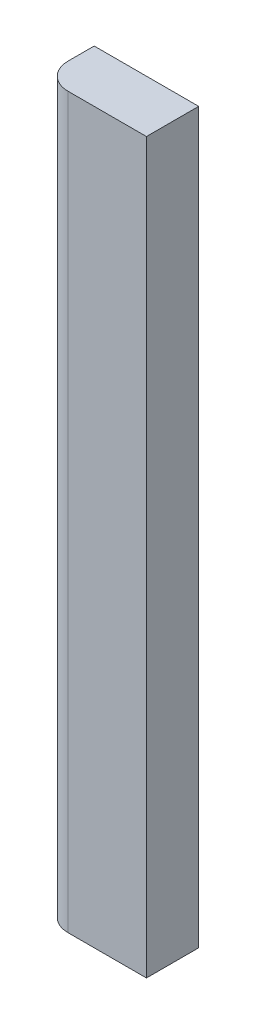
ISO-10303-21;
HEADER;
FILE_DESCRIPTION(('STEP AP214'),'2;1');
FILE_NAME('part.step','',(''),(''),'','','');
FILE_SCHEMA(('AUTOMOTIVE_DESIGN { 1 0 10303 214 1 1 1 1 }'));
ENDSEC;
DATA;
#1=APPLICATION_CONTEXT('core data for automotive mechanical design processes');
#2=APPLICATION_PROTOCOL_DEFINITION('international standard','automotive_design',2000,#1);
#3=PRODUCT_CONTEXT('',#1,'mechanical');
#4=PRODUCT('Part','Part','',(#3));
#5=PRODUCT_RELATED_PRODUCT_CATEGORY('part','',(#4));
#6=PRODUCT_DEFINITION_FORMATION('','',#4);
#7=PRODUCT_DEFINITION_CONTEXT('part definition',#1,'design');
#8=PRODUCT_DEFINITION('design','',#6,#7);
#9=PRODUCT_DEFINITION_SHAPE('','',#8);
#10=(LENGTH_UNIT() NAMED_UNIT(*) SI_UNIT(.MILLI.,.METRE.));
#11=(NAMED_UNIT(*) PLANE_ANGLE_UNIT() SI_UNIT($,.RADIAN.));
#12=(NAMED_UNIT(*) SI_UNIT($,.STERADIAN.) SOLID_ANGLE_UNIT());
#13=UNCERTAINTY_MEASURE_WITH_UNIT(LENGTH_MEASURE(1.E-05),#10,'distance_accuracy_value','');
#14=(GEOMETRIC_REPRESENTATION_CONTEXT(3) GLOBAL_UNCERTAINTY_ASSIGNED_CONTEXT((#13)) GLOBAL_UNIT_ASSIGNED_CONTEXT((#10,
#11,#12)) REPRESENTATION_CONTEXT('',''));
#15=CARTESIAN_POINT('',(0.,0.,0.));
#16=DIRECTION('',(0.,0.,1.));
#17=DIRECTION('',(1.,0.,0.));
#18=AXIS2_PLACEMENT_3D('',#15,#16,#17);
#19=CARTESIAN_POINT('',(-17.2695298558042,-33.5080430037992,50.8));
#20=DIRECTION('',(0.,1.,0.));
#21=DIRECTION('',(0.,0.,1.));
#22=AXIS2_PLACEMENT_3D('',#19,#20,#21);
#23=PLANE('',#22);
#24=DIRECTION('',(1.,0.,0.));
#25=VECTOR('',#24,1.);
#26=CARTESIAN_POINT('',(-17.2695298558042,-33.5080430037992,50.8));
#27=LINE('',#26,#25);
#28=CARTESIAN_POINT('',(8.13047014419578,-33.5080430037992,50.8));
#29=VERTEX_POINT('',#28);
#30=CARTESIAN_POINT('',(84.3304701441958,-33.5080430037992,50.8));
#31=VERTEX_POINT('',#30);
#32=EDGE_CURVE('E85',#29,#31,#27,.T.);
#33=ORIENTED_EDGE('',*,*,#32,.F.);
#34=CARTESIAN_POINT('',(8.13047014419579,-33.5080430037992,25.4));
#35=DIRECTION('',(0.,1.,0.));
#36=DIRECTION('',(0.,0.,1.));
#37=AXIS2_PLACEMENT_3D('',#34,#35,#36);
#38=CIRCLE('',#37,25.4);
#39=CARTESIAN_POINT('',(-17.2695298558042,-33.5080430037992,25.4));
#40=VERTEX_POINT('',#39);
#41=EDGE_CURVE('E62',#29,#40,#38,.F.);
#42=ORIENTED_EDGE('',*,*,#41,.T.);
#43=DIRECTION('',(0.,0.,-1.));
#44=VECTOR('',#43,1.);
#45=CARTESIAN_POINT('',(-17.2695298558042,-33.5080430037992,50.8));
#46=LINE('',#45,#44);
#47=CARTESIAN_POINT('',(-17.2695298558042,-33.5080430037992,0.));
#48=VERTEX_POINT('',#47);
#49=EDGE_CURVE('E112',#40,#48,#46,.T.);
#50=ORIENTED_EDGE('',*,*,#49,.T.);
#51=DIRECTION('',(1.,0.,0.));
#52=VECTOR('',#51,1.);
#53=CARTESIAN_POINT('',(-17.2695298558042,-33.5080430037992,0.));
#54=LINE('',#53,#52);
#55=CARTESIAN_POINT('',(84.3304701441958,-33.5080430037992,0.));
#56=VERTEX_POINT('',#55);
#57=EDGE_CURVE('E99',#48,#56,#54,.T.);
#58=ORIENTED_EDGE('',*,*,#57,.T.);
#59=DIRECTION('',(0.,0.,-1.));
#60=VECTOR('',#59,1.);
#61=CARTESIAN_POINT('',(84.3304701441958,-33.5080430037992,50.8));
#62=LINE('',#61,#60);
#63=EDGE_CURVE('E97',#31,#56,#62,.T.);
#64=ORIENTED_EDGE('',*,*,#63,.F.);
#65=EDGE_LOOP('',(#33,#42,#50,#58,#64));
#66=FACE_BOUND('',#65,.T.);
#67=ADVANCED_FACE('F39',(#66),#23,.F.);
#68=CARTESIAN_POINT('',(84.3304701441957,674.897956996201,50.8));
#69=DIRECTION('',(1.,0.,0.));
#70=DIRECTION('',(0.,1.,0.));
#71=AXIS2_PLACEMENT_3D('',#68,#69,#70);
#72=PLANE('',#71);
#73=DIRECTION('',(0.,-1.,0.));
#74=VECTOR('',#73,1.);
#75=CARTESIAN_POINT('',(84.3304701441957,674.897956996201,0.));
#76=LINE('',#75,#74);
#77=CARTESIAN_POINT('',(84.3304701441957,674.897956996201,0.));
#78=VERTEX_POINT('',#77);
#79=EDGE_CURVE('E117',#78,#56,#76,.T.);
#80=ORIENTED_EDGE('',*,*,#79,.F.);
#81=DIRECTION('',(0.,0.,-1.));
#82=VECTOR('',#81,1.);
#83=CARTESIAN_POINT('',(84.3304701441957,674.897956996201,50.8));
#84=LINE('',#83,#82);
#85=CARTESIAN_POINT('',(84.3304701441957,674.897956996201,50.8));
#86=VERTEX_POINT('',#85);
#87=EDGE_CURVE('E104',#86,#78,#84,.T.);
#88=ORIENTED_EDGE('',*,*,#87,.F.);
#89=DIRECTION('',(0.,-1.,0.));
#90=VECTOR('',#89,1.);
#91=CARTESIAN_POINT('',(84.3304701441957,674.897956996201,50.8));
#92=LINE('',#91,#90);
#93=EDGE_CURVE('E90',#86,#31,#92,.T.);
#94=ORIENTED_EDGE('',*,*,#93,.T.);
#95=ORIENTED_EDGE('',*,*,#63,.T.);
#96=EDGE_LOOP('',(#80,#88,#94,#95));
#97=FACE_BOUND('',#96,.T.);
#98=ADVANCED_FACE('F107',(#97),#72,.T.);
#99=CARTESIAN_POINT('',(-17.2695298558043,674.897956996201,50.8));
#100=DIRECTION('',(0.,1.,0.));
#101=DIRECTION('',(0.,0.,1.));
#102=AXIS2_PLACEMENT_3D('',#99,#100,#101);
#103=PLANE('',#102);
#104=DIRECTION('',(0.,0.,-1.));
#105=VECTOR('',#104,1.);
#106=CARTESIAN_POINT('',(-17.2695298558043,674.897956996201,50.8));
#107=LINE('',#106,#105);
#108=CARTESIAN_POINT('',(-17.2695298558043,674.897956996201,25.4));
#109=VERTEX_POINT('',#108);
#110=CARTESIAN_POINT('',(-17.2695298558043,674.897956996201,0.));
#111=VERTEX_POINT('',#110);
#112=EDGE_CURVE('E129',#109,#111,#107,.T.);
#113=ORIENTED_EDGE('',*,*,#112,.F.);
#114=CARTESIAN_POINT('',(8.13047014419571,674.897956996201,25.4));
#115=DIRECTION('',(0.,1.,0.));
#116=DIRECTION('',(0.,0.,1.));
#117=AXIS2_PLACEMENT_3D('',#114,#115,#116);
#118=CIRCLE('',#117,25.4);
#119=CARTESIAN_POINT('',(8.1304701441957,674.897956996201,50.8));
#120=VERTEX_POINT('',#119);
#121=EDGE_CURVE('E11',#109,#120,#118,.T.);
#122=ORIENTED_EDGE('',*,*,#121,.T.);
#123=DIRECTION('',(1.,0.,0.));
#124=VECTOR('',#123,1.);
#125=CARTESIAN_POINT('',(-17.2695298558043,674.897956996201,50.8));
#126=LINE('',#125,#124);
#127=EDGE_CURVE('E109',#120,#86,#126,.T.);
#128=ORIENTED_EDGE('',*,*,#127,.T.);
#129=ORIENTED_EDGE('',*,*,#87,.T.);
#130=DIRECTION('',(1.,0.,0.));
#131=VECTOR('',#130,1.);
#132=CARTESIAN_POINT('',(-17.2695298558043,674.897956996201,0.));
#133=LINE('',#132,#131);
#134=EDGE_CURVE('E120',#111,#78,#133,.T.);
#135=ORIENTED_EDGE('',*,*,#134,.F.);
#136=EDGE_LOOP('',(#113,#122,#128,#129,#135));
#137=FACE_BOUND('',#136,.T.);
#138=ADVANCED_FACE('F140',(#137),#103,.T.);
#139=CARTESIAN_POINT('',(-17.2695298558043,674.897956996201,50.8));
#140=DIRECTION('',(1.,0.,0.));
#141=DIRECTION('',(0.,1.,0.));
#142=AXIS2_PLACEMENT_3D('',#139,#140,#141);
#143=PLANE('',#142);
#144=ORIENTED_EDGE('',*,*,#49,.F.);
#145=DIRECTION('',(0.,-1.,0.));
#146=VECTOR('',#145,1.);
#147=CARTESIAN_POINT('',(-17.2695298558043,674.897956996201,25.4));
#148=LINE('',#147,#146);
#149=EDGE_CURVE('E48',#40,#109,#148,.F.);
#150=ORIENTED_EDGE('',*,*,#149,.T.);
#151=ORIENTED_EDGE('',*,*,#112,.T.);
#152=DIRECTION('',(0.,-1.,0.));
#153=VECTOR('',#152,1.);
#154=CARTESIAN_POINT('',(-17.2695298558043,674.897956996201,0.));
#155=LINE('',#154,#153);
#156=EDGE_CURVE('E94',#111,#48,#155,.T.);
#157=ORIENTED_EDGE('',*,*,#156,.T.);
#158=EDGE_LOOP('',(#144,#150,#151,#157));
#159=FACE_BOUND('',#158,.T.);
#160=ADVANCED_FACE('F144',(#159),#143,.F.);
#161=CARTESIAN_POINT('',(0.,0.,50.8));
#162=DIRECTION('',(0.,0.,-1.));
#163=DIRECTION('',(-1.,0.,0.));
#164=AXIS2_PLACEMENT_3D('',#161,#162,#163);
#165=PLANE('',#164);
#166=ORIENTED_EDGE('',*,*,#127,.F.);
#167=DIRECTION('',(0.,-1.,0.));
#168=VECTOR('',#167,1.);
#169=CARTESIAN_POINT('',(8.13047014419578,0.,50.8));
#170=LINE('',#169,#168);
#171=EDGE_CURVE('E92',#120,#29,#170,.T.);
#172=ORIENTED_EDGE('',*,*,#171,.T.);
#173=ORIENTED_EDGE('',*,*,#32,.T.);
#174=ORIENTED_EDGE('',*,*,#93,.F.);
#175=EDGE_LOOP('',(#166,#172,#173,#174));
#176=FACE_BOUND('',#175,.T.);
#177=ADVANCED_FACE('F88',(#176),#165,.F.);
#178=CARTESIAN_POINT('',(0.,0.,0.));
#179=DIRECTION('',(0.,0.,-1.));
#180=DIRECTION('',(-1.,0.,0.));
#181=AXIS2_PLACEMENT_3D('',#178,#179,#180);
#182=PLANE('',#181);
#183=ORIENTED_EDGE('',*,*,#57,.F.);
#184=ORIENTED_EDGE('',*,*,#156,.F.);
#185=ORIENTED_EDGE('',*,*,#134,.T.);
#186=ORIENTED_EDGE('',*,*,#79,.T.);
#187=EDGE_LOOP('',(#183,#184,#185,#186));
#188=FACE_BOUND('',#187,.T.);
#189=ADVANCED_FACE('F143',(#188),#182,.T.);
#190=CARTESIAN_POINT('',(8.13047014419578,0.,25.4));
#191=DIRECTION('',(0.,-1.,0.));
#192=DIRECTION('',(1.,0.,0.));
#193=AXIS2_PLACEMENT_3D('',#190,#191,#192);
#194=CYLINDRICAL_SURFACE('',#193,25.4);
#195=ORIENTED_EDGE('',*,*,#121,.F.);
#196=ORIENTED_EDGE('',*,*,#149,.F.);
#197=ORIENTED_EDGE('',*,*,#41,.F.);
#198=ORIENTED_EDGE('',*,*,#171,.F.);
#199=EDGE_LOOP('',(#195,#196,#197,#198));
#200=FACE_BOUND('',#199,.T.);
#201=ADVANCED_FACE('F41',(#200),#194,.T.);
#202=CLOSED_SHELL('',(#67,#98,#138,#160,#177,#189,#201));
#203=MANIFOLD_SOLID_BREP('B2',#202);
#204=ADVANCED_BREP_SHAPE_REPRESENTATION('',(#18,#203),#14);
#205=SHAPE_DEFINITION_REPRESENTATION(#9,#204);
ENDSEC;
END-ISO-10303-21;
